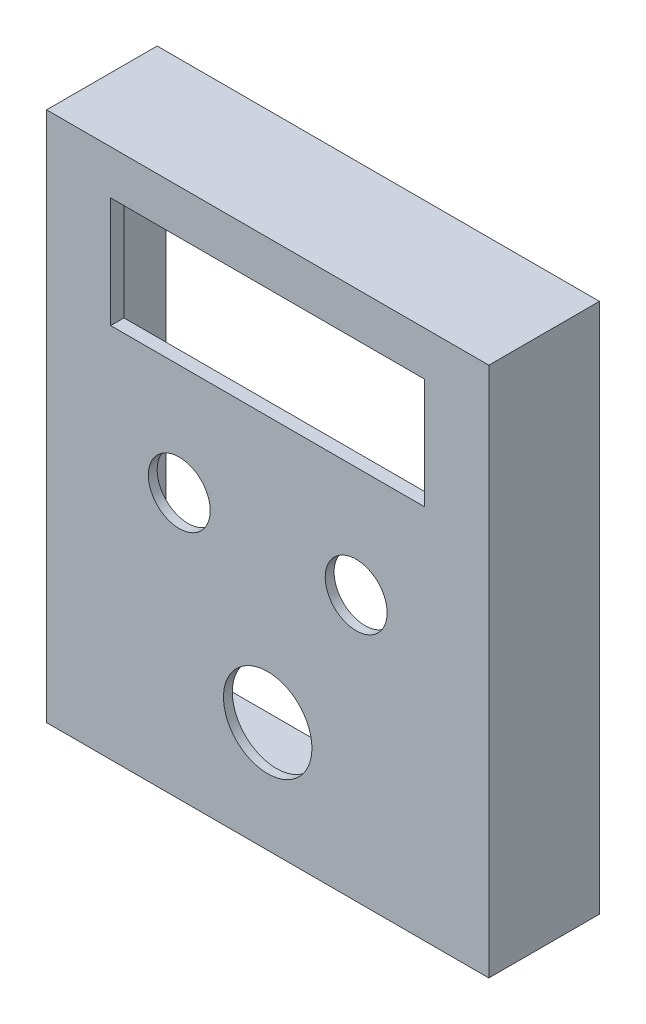
ISO-10303-21;
HEADER;
FILE_DESCRIPTION(('STEP AP214'),'2;1');
FILE_NAME('part.step','',(''),(''),'','','');
FILE_SCHEMA(('AUTOMOTIVE_DESIGN { 1 0 10303 214 1 1 1 1 }'));
ENDSEC;
DATA;
#1=APPLICATION_CONTEXT('core data for automotive mechanical design processes');
#2=APPLICATION_PROTOCOL_DEFINITION('international standard','automotive_design',2000,#1);
#3=PRODUCT_CONTEXT('',#1,'mechanical');
#4=PRODUCT('Part','Part','',(#3));
#5=PRODUCT_RELATED_PRODUCT_CATEGORY('part','',(#4));
#6=PRODUCT_DEFINITION_FORMATION('','',#4);
#7=PRODUCT_DEFINITION_CONTEXT('part definition',#1,'design');
#8=PRODUCT_DEFINITION('design','',#6,#7);
#9=PRODUCT_DEFINITION_SHAPE('','',#8);
#10=(LENGTH_UNIT() NAMED_UNIT(*) SI_UNIT(.MILLI.,.METRE.));
#11=(NAMED_UNIT(*) PLANE_ANGLE_UNIT() SI_UNIT($,.RADIAN.));
#12=(NAMED_UNIT(*) SI_UNIT($,.STERADIAN.) SOLID_ANGLE_UNIT());
#13=UNCERTAINTY_MEASURE_WITH_UNIT(LENGTH_MEASURE(1.E-05),#10,'distance_accuracy_value','');
#14=(GEOMETRIC_REPRESENTATION_CONTEXT(3) GLOBAL_UNCERTAINTY_ASSIGNED_CONTEXT((#13)) GLOBAL_UNIT_ASSIGNED_CONTEXT((#10,
#11,#12)) REPRESENTATION_CONTEXT('',''));
#15=CARTESIAN_POINT('',(0.,0.,0.));
#16=DIRECTION('',(0.,0.,1.));
#17=DIRECTION('',(1.,0.,0.));
#18=AXIS2_PLACEMENT_3D('',#15,#16,#17);
#19=CARTESIAN_POINT('',(0.,0.,0.));
#20=DIRECTION('',(0.,0.,1.));
#21=DIRECTION('',(1.,0.,0.));
#22=AXIS2_PLACEMENT_3D('',#19,#20,#21);
#23=PLANE('',#22);
#24=DIRECTION('',(0.,1.,0.));
#25=VECTOR('',#24,1.);
#26=CARTESIAN_POINT('',(98.,0.,0.));
#27=LINE('',#26,#25);
#28=CARTESIAN_POINT('',(98.,-58.,0.));
#29=VERTEX_POINT('',#28);
#30=CARTESIAN_POINT('',(98.,58.,0.));
#31=VERTEX_POINT('',#30);
#32=EDGE_CURVE('E11',#29,#31,#27,.T.);
#33=ORIENTED_EDGE('',*,*,#32,.T.);
#34=DIRECTION('',(-1.,0.,0.));
#35=VECTOR('',#34,1.);
#36=CARTESIAN_POINT('',(100.,58.,0.));
#37=LINE('',#36,#35);
#38=CARTESIAN_POINT('',(2.,58.,0.));
#39=VERTEX_POINT('',#38);
#40=EDGE_CURVE('E58',#31,#39,#37,.T.);
#41=ORIENTED_EDGE('',*,*,#40,.T.);
#42=DIRECTION('',(0.,1.,0.));
#43=VECTOR('',#42,1.);
#44=CARTESIAN_POINT('',(2.,0.,0.));
#45=LINE('',#44,#43);
#46=CARTESIAN_POINT('',(2.,-58.,0.));
#47=VERTEX_POINT('',#46);
#48=EDGE_CURVE('E154',#47,#39,#45,.T.);
#49=ORIENTED_EDGE('',*,*,#48,.F.);
#50=DIRECTION('',(1.,0.,0.));
#51=VECTOR('',#50,1.);
#52=CARTESIAN_POINT('',(100.,-58.,0.));
#53=LINE('',#52,#51);
#54=EDGE_CURVE('E44',#47,#29,#53,.T.);
#55=ORIENTED_EDGE('',*,*,#54,.T.);
#56=EDGE_LOOP('',(#33,#41,#49,#55));
#57=FACE_BOUND('',#56,.T.);
#58=DIRECTION('',(1.,0.,0.));
#59=VECTOR('',#58,1.);
#60=CARTESIAN_POINT('',(100.,-60.,0.));
#61=LINE('',#60,#59);
#62=CARTESIAN_POINT('',(0.,-60.,0.));
#63=VERTEX_POINT('',#62);
#64=CARTESIAN_POINT('',(100.,-60.,0.));
#65=VERTEX_POINT('',#64);
#66=EDGE_CURVE('E270',#63,#65,#61,.T.);
#67=ORIENTED_EDGE('',*,*,#66,.F.);
#68=DIRECTION('',(0.,1.,0.));
#69=VECTOR('',#68,1.);
#70=CARTESIAN_POINT('',(0.,0.,0.));
#71=LINE('',#70,#69);
#72=CARTESIAN_POINT('',(0.,60.,0.));
#73=VERTEX_POINT('',#72);
#74=EDGE_CURVE('E265',#63,#73,#71,.T.);
#75=ORIENTED_EDGE('',*,*,#74,.T.);
#76=DIRECTION('',(-1.,0.,0.));
#77=VECTOR('',#76,1.);
#78=CARTESIAN_POINT('',(100.,60.,0.));
#79=LINE('',#78,#77);
#80=CARTESIAN_POINT('',(100.,60.,0.));
#81=VERTEX_POINT('',#80);
#82=EDGE_CURVE('E269',#81,#73,#79,.T.);
#83=ORIENTED_EDGE('',*,*,#82,.F.);
#84=DIRECTION('',(0.,1.,0.));
#85=VECTOR('',#84,1.);
#86=CARTESIAN_POINT('',(100.,0.,0.));
#87=LINE('',#86,#85);
#88=EDGE_CURVE('E39',#65,#81,#87,.T.);
#89=ORIENTED_EDGE('',*,*,#88,.F.);
#90=EDGE_LOOP('',(#67,#75,#83,#89));
#91=FACE_BOUND('',#90,.T.);
#92=ADVANCED_FACE('F36',(#57,#91),#23,.F.);
#93=CARTESIAN_POINT('',(0.,0.,22.));
#94=DIRECTION('',(0.,0.,-1.));
#95=DIRECTION('',(-1.,0.,0.));
#96=AXIS2_PLACEMENT_3D('',#93,#94,#95);
#97=PLANE('',#96);
#98=DIRECTION('',(0.,1.,0.));
#99=VECTOR('',#98,1.);
#100=CARTESIAN_POINT('',(87.5,25.,22.));
#101=LINE('',#100,#99);
#102=CARTESIAN_POINT('',(87.5,23.,22.));
#103=VERTEX_POINT('',#102);
#104=CARTESIAN_POINT('',(87.5,52.,22.));
#105=VERTEX_POINT('',#104);
#106=EDGE_CURVE('E192',#103,#105,#101,.T.);
#107=ORIENTED_EDGE('',*,*,#106,.F.);
#108=DIRECTION('',(1.,0.,0.));
#109=VECTOR('',#108,1.);
#110=CARTESIAN_POINT('',(14.5,23.,22.));
#111=LINE('',#110,#109);
#112=CARTESIAN_POINT('',(12.5,23.,22.));
#113=VERTEX_POINT('',#112);
#114=EDGE_CURVE('E187',#113,#103,#111,.T.);
#115=ORIENTED_EDGE('',*,*,#114,.F.);
#116=DIRECTION('',(0.,-1.,0.));
#117=VECTOR('',#116,1.);
#118=CARTESIAN_POINT('',(12.5,25.,22.));
#119=LINE('',#118,#117);
#120=CARTESIAN_POINT('',(12.5,52.,22.));
#121=VERTEX_POINT('',#120);
#122=EDGE_CURVE('E199',#121,#113,#119,.T.);
#123=ORIENTED_EDGE('',*,*,#122,.F.);
#124=DIRECTION('',(-1.,0.,0.));
#125=VECTOR('',#124,1.);
#126=CARTESIAN_POINT('',(14.5,52.,22.));
#127=LINE('',#126,#125);
#128=EDGE_CURVE('E195',#105,#121,#127,.T.);
#129=ORIENTED_EDGE('',*,*,#128,.F.);
#130=EDGE_LOOP('',(#107,#115,#123,#129));
#131=FACE_BOUND('',#130,.T.);
#132=DIRECTION('',(0.,1.,0.));
#133=VECTOR('',#132,1.);
#134=CARTESIAN_POINT('',(85.5,25.,22.));
#135=LINE('',#134,#133);
#136=CARTESIAN_POINT('',(85.5,25.,22.));
#137=VERTEX_POINT('',#136);
#138=CARTESIAN_POINT('',(85.5,50.,22.));
#139=VERTEX_POINT('',#138);
#140=EDGE_CURVE('E204',#137,#139,#135,.T.);
#141=ORIENTED_EDGE('',*,*,#140,.T.);
#142=DIRECTION('',(-1.,0.,0.));
#143=VECTOR('',#142,1.);
#144=CARTESIAN_POINT('',(14.5,50.,22.));
#145=LINE('',#144,#143);
#146=CARTESIAN_POINT('',(14.5,50.,22.));
#147=VERTEX_POINT('',#146);
#148=EDGE_CURVE('E206',#139,#147,#145,.T.);
#149=ORIENTED_EDGE('',*,*,#148,.T.);
#150=DIRECTION('',(0.,-1.,0.));
#151=VECTOR('',#150,1.);
#152=CARTESIAN_POINT('',(14.5,25.,22.));
#153=LINE('',#152,#151);
#154=CARTESIAN_POINT('',(14.5,25.,22.));
#155=VERTEX_POINT('',#154);
#156=EDGE_CURVE('E209',#147,#155,#153,.T.);
#157=ORIENTED_EDGE('',*,*,#156,.T.);
#158=DIRECTION('',(1.,0.,0.));
#159=VECTOR('',#158,1.);
#160=CARTESIAN_POINT('',(14.5,25.,22.));
#161=LINE('',#160,#159);
#162=EDGE_CURVE('E211',#155,#137,#161,.T.);
#163=ORIENTED_EDGE('',*,*,#162,.T.);
#164=EDGE_LOOP('',(#141,#149,#157,#163));
#165=FACE_BOUND('',#164,.T.);
#166=ADVANCED_FACE('F301',(#131,#165),#97,.T.);
#167=CARTESIAN_POINT('',(14.5,25.,22.));
#168=DIRECTION('',(-1.,0.,0.));
#169=DIRECTION('',(0.,0.,1.));
#170=AXIS2_PLACEMENT_3D('',#167,#168,#169);
#171=PLANE('',#170);
#172=DIRECTION('',(0.,-1.,0.));
#173=VECTOR('',#172,1.);
#174=CARTESIAN_POINT('',(14.5,25.,25.));
#175=LINE('',#174,#173);
#176=CARTESIAN_POINT('',(14.5,50.,25.));
#177=VERTEX_POINT('',#176);
#178=CARTESIAN_POINT('',(14.5,25.,25.));
#179=VERTEX_POINT('',#178);
#180=EDGE_CURVE('E218',#177,#179,#175,.T.);
#181=ORIENTED_EDGE('',*,*,#180,.T.);
#182=DIRECTION('',(0.,0.,1.));
#183=VECTOR('',#182,1.);
#184=CARTESIAN_POINT('',(14.5,25.,22.));
#185=LINE('',#184,#183);
#186=EDGE_CURVE('E226',#155,#179,#185,.T.);
#187=ORIENTED_EDGE('',*,*,#186,.F.);
#188=ORIENTED_EDGE('',*,*,#156,.F.);
#189=DIRECTION('',(0.,0.,1.));
#190=VECTOR('',#189,1.);
#191=CARTESIAN_POINT('',(14.5,50.,22.));
#192=LINE('',#191,#190);
#193=EDGE_CURVE('E228',#147,#177,#192,.T.);
#194=ORIENTED_EDGE('',*,*,#193,.T.);
#195=EDGE_LOOP('',(#181,#187,#188,#194));
#196=FACE_BOUND('',#195,.T.);
#197=ADVANCED_FACE('F305',(#196),#171,.F.);
#198=CARTESIAN_POINT('',(14.5,25.,22.));
#199=DIRECTION('',(0.,-1.,0.));
#200=DIRECTION('',(0.,0.,-1.));
#201=AXIS2_PLACEMENT_3D('',#198,#199,#200);
#202=PLANE('',#201);
#203=DIRECTION('',(1.,0.,0.));
#204=VECTOR('',#203,1.);
#205=CARTESIAN_POINT('',(14.5,25.,25.));
#206=LINE('',#205,#204);
#207=CARTESIAN_POINT('',(85.5,25.,25.));
#208=VERTEX_POINT('',#207);
#209=EDGE_CURVE('E207',#179,#208,#206,.T.);
#210=ORIENTED_EDGE('',*,*,#209,.T.);
#211=DIRECTION('',(0.,0.,1.));
#212=VECTOR('',#211,1.);
#213=CARTESIAN_POINT('',(85.5,25.,22.));
#214=LINE('',#213,#212);
#215=EDGE_CURVE('E223',#137,#208,#214,.T.);
#216=ORIENTED_EDGE('',*,*,#215,.F.);
#217=ORIENTED_EDGE('',*,*,#162,.F.);
#218=ORIENTED_EDGE('',*,*,#186,.T.);
#219=EDGE_LOOP('',(#210,#216,#217,#218));
#220=FACE_BOUND('',#219,.T.);
#221=ADVANCED_FACE('F347',(#220),#202,.F.);
#222=CARTESIAN_POINT('',(85.5,25.,22.));
#223=DIRECTION('',(1.,0.,0.));
#224=DIRECTION('',(0.,0.,-1.));
#225=AXIS2_PLACEMENT_3D('',#222,#223,#224);
#226=PLANE('',#225);
#227=DIRECTION('',(0.,1.,0.));
#228=VECTOR('',#227,1.);
#229=CARTESIAN_POINT('',(85.5,25.,25.));
#230=LINE('',#229,#228);
#231=CARTESIAN_POINT('',(85.5,50.,25.));
#232=VERTEX_POINT('',#231);
#233=EDGE_CURVE('E164',#208,#232,#230,.T.);
#234=ORIENTED_EDGE('',*,*,#233,.T.);
#235=DIRECTION('',(0.,0.,1.));
#236=VECTOR('',#235,1.);
#237=CARTESIAN_POINT('',(85.5,50.,22.));
#238=LINE('',#237,#236);
#239=EDGE_CURVE('E213',#139,#232,#238,.T.);
#240=ORIENTED_EDGE('',*,*,#239,.F.);
#241=ORIENTED_EDGE('',*,*,#140,.F.);
#242=ORIENTED_EDGE('',*,*,#215,.T.);
#243=EDGE_LOOP('',(#234,#240,#241,#242));
#244=FACE_BOUND('',#243,.T.);
#245=ADVANCED_FACE('F350',(#244),#226,.F.);
#246=CARTESIAN_POINT('',(14.5,50.,22.));
#247=DIRECTION('',(0.,1.,0.));
#248=DIRECTION('',(0.,0.,1.));
#249=AXIS2_PLACEMENT_3D('',#246,#247,#248);
#250=PLANE('',#249);
#251=DIRECTION('',(-1.,0.,0.));
#252=VECTOR('',#251,1.);
#253=CARTESIAN_POINT('',(14.5,50.,25.));
#254=LINE('',#253,#252);
#255=EDGE_CURVE('E215',#232,#177,#254,.T.);
#256=ORIENTED_EDGE('',*,*,#255,.T.);
#257=ORIENTED_EDGE('',*,*,#193,.F.);
#258=ORIENTED_EDGE('',*,*,#148,.F.);
#259=ORIENTED_EDGE('',*,*,#239,.T.);
#260=EDGE_LOOP('',(#256,#257,#258,#259));
#261=FACE_BOUND('',#260,.T.);
#262=ADVANCED_FACE('F355',(#261),#250,.F.);
#263=CARTESIAN_POINT('',(87.5,25.,22.));
#264=DIRECTION('',(1.,0.,0.));
#265=DIRECTION('',(0.,0.,-1.));
#266=AXIS2_PLACEMENT_3D('',#263,#264,#265);
#267=PLANE('',#266);
#268=DIRECTION('',(0.,1.,0.));
#269=VECTOR('',#268,1.);
#270=CARTESIAN_POINT('',(87.5,25.,23.));
#271=LINE('',#270,#269);
#272=CARTESIAN_POINT('',(87.5,23.,23.));
#273=VERTEX_POINT('',#272);
#274=CARTESIAN_POINT('',(87.5,52.,23.));
#275=VERTEX_POINT('',#274);
#276=EDGE_CURVE('E254',#273,#275,#271,.T.);
#277=ORIENTED_EDGE('',*,*,#276,.F.);
#278=DIRECTION('',(0.,0.,1.));
#279=VECTOR('',#278,1.);
#280=CARTESIAN_POINT('',(87.5,23.,22.));
#281=LINE('',#280,#279);
#282=EDGE_CURVE('E155',#103,#273,#281,.T.);
#283=ORIENTED_EDGE('',*,*,#282,.F.);
#284=ORIENTED_EDGE('',*,*,#106,.T.);
#285=DIRECTION('',(0.,0.,1.));
#286=VECTOR('',#285,1.);
#287=CARTESIAN_POINT('',(87.5,52.,22.));
#288=LINE('',#287,#286);
#289=EDGE_CURVE('E183',#105,#275,#288,.T.);
#290=ORIENTED_EDGE('',*,*,#289,.T.);
#291=EDGE_LOOP('',(#277,#283,#284,#290));
#292=FACE_BOUND('',#291,.T.);
#293=ADVANCED_FACE('F329',(#292),#267,.T.);
#294=CARTESIAN_POINT('',(14.5,23.,22.));
#295=DIRECTION('',(0.,-1.,0.));
#296=DIRECTION('',(0.,0.,-1.));
#297=AXIS2_PLACEMENT_3D('',#294,#295,#296);
#298=PLANE('',#297);
#299=DIRECTION('',(1.,0.,0.));
#300=VECTOR('',#299,1.);
#301=CARTESIAN_POINT('',(14.5,23.,23.));
#302=LINE('',#301,#300);
#303=CARTESIAN_POINT('',(12.5,23.,23.));
#304=VERTEX_POINT('',#303);
#305=EDGE_CURVE('E196',#304,#273,#302,.T.);
#306=ORIENTED_EDGE('',*,*,#305,.F.);
#307=DIRECTION('',(0.,0.,1.));
#308=VECTOR('',#307,1.);
#309=CARTESIAN_POINT('',(12.5,23.,22.));
#310=LINE('',#309,#308);
#311=EDGE_CURVE('E189',#113,#304,#310,.T.);
#312=ORIENTED_EDGE('',*,*,#311,.F.);
#313=ORIENTED_EDGE('',*,*,#114,.T.);
#314=ORIENTED_EDGE('',*,*,#282,.T.);
#315=EDGE_LOOP('',(#306,#312,#313,#314));
#316=FACE_BOUND('',#315,.T.);
#317=ADVANCED_FACE('F325',(#316),#298,.T.);
#318=CARTESIAN_POINT('',(12.5,25.,22.));
#319=DIRECTION('',(-1.,0.,0.));
#320=DIRECTION('',(0.,0.,1.));
#321=AXIS2_PLACEMENT_3D('',#318,#319,#320);
#322=PLANE('',#321);
#323=DIRECTION('',(0.,-1.,0.));
#324=VECTOR('',#323,1.);
#325=CARTESIAN_POINT('',(12.5,25.,23.));
#326=LINE('',#325,#324);
#327=CARTESIAN_POINT('',(12.5,52.,23.));
#328=VERTEX_POINT('',#327);
#329=EDGE_CURVE('E175',#328,#304,#326,.T.);
#330=ORIENTED_EDGE('',*,*,#329,.F.);
#331=DIRECTION('',(0.,0.,1.));
#332=VECTOR('',#331,1.);
#333=CARTESIAN_POINT('',(12.5,52.,22.));
#334=LINE('',#333,#332);
#335=EDGE_CURVE('E186',#121,#328,#334,.T.);
#336=ORIENTED_EDGE('',*,*,#335,.F.);
#337=ORIENTED_EDGE('',*,*,#122,.T.);
#338=ORIENTED_EDGE('',*,*,#311,.T.);
#339=EDGE_LOOP('',(#330,#336,#337,#338));
#340=FACE_BOUND('',#339,.T.);
#341=ADVANCED_FACE('F335',(#340),#322,.T.);
#342=CARTESIAN_POINT('',(14.5,52.,22.));
#343=DIRECTION('',(0.,1.,0.));
#344=DIRECTION('',(0.,0.,1.));
#345=AXIS2_PLACEMENT_3D('',#342,#343,#344);
#346=PLANE('',#345);
#347=DIRECTION('',(-1.,0.,0.));
#348=VECTOR('',#347,1.);
#349=CARTESIAN_POINT('',(14.5,52.,23.));
#350=LINE('',#349,#348);
#351=EDGE_CURVE('E313',#275,#328,#350,.T.);
#352=ORIENTED_EDGE('',*,*,#351,.F.);
#353=ORIENTED_EDGE('',*,*,#289,.F.);
#354=ORIENTED_EDGE('',*,*,#128,.T.);
#355=ORIENTED_EDGE('',*,*,#335,.T.);
#356=EDGE_LOOP('',(#352,#353,#354,#355));
#357=FACE_BOUND('',#356,.T.);
#358=ADVANCED_FACE('F334',(#357),#346,.T.);
#359=CARTESIAN_POINT('',(50.,-35.,22.));
#360=DIRECTION('',(0.,0.,1.));
#361=DIRECTION('',(1.,0.,0.));
#362=AXIS2_PLACEMENT_3D('',#359,#360,#361);
#363=CYLINDRICAL_SURFACE('',#362,10.);
#364=CARTESIAN_POINT('',(50.,-35.,23.));
#365=DIRECTION('',(0.,0.,-1.));
#366=DIRECTION('',(-1.,0.,0.));
#367=AXIS2_PLACEMENT_3D('',#364,#365,#366);
#368=CIRCLE('',#367,10.);
#369=CARTESIAN_POINT('',(40.,-35.,23.));
#370=VERTEX_POINT('',#369);
#371=EDGE_CURVE('E251',#370,#370,#368,.T.);
#372=ORIENTED_EDGE('',*,*,#371,.T.);
#373=EDGE_LOOP('',(#372));
#374=FACE_BOUND('',#373,.T.);
#375=CARTESIAN_POINT('',(50.,-35.,25.));
#376=DIRECTION('',(0.,0.,1.));
#377=DIRECTION('',(1.,0.,0.));
#378=AXIS2_PLACEMENT_3D('',#375,#376,#377);
#379=CIRCLE('',#378,10.);
#380=CARTESIAN_POINT('',(60.,-35.,25.));
#381=VERTEX_POINT('',#380);
#382=EDGE_CURVE('E255',#381,#381,#379,.T.);
#383=ORIENTED_EDGE('',*,*,#382,.T.);
#384=EDGE_LOOP('',(#383));
#385=FACE_BOUND('',#384,.T.);
#386=ADVANCED_FACE('F342',(#374,#385),#363,.F.);
#387=CARTESIAN_POINT('',(70.,0.,22.));
#388=DIRECTION('',(0.,0.,1.));
#389=DIRECTION('',(1.,0.,0.));
#390=AXIS2_PLACEMENT_3D('',#387,#388,#389);
#391=CYLINDRICAL_SURFACE('',#390,7.);
#392=CARTESIAN_POINT('',(70.,0.,23.));
#393=DIRECTION('',(0.,0.,-1.));
#394=DIRECTION('',(-1.,0.,0.));
#395=AXIS2_PLACEMENT_3D('',#392,#393,#394);
#396=CIRCLE('',#395,7.);
#397=CARTESIAN_POINT('',(63.,0.,23.));
#398=VERTEX_POINT('',#397);
#399=EDGE_CURVE('E256',#398,#398,#396,.T.);
#400=ORIENTED_EDGE('',*,*,#399,.T.);
#401=EDGE_LOOP('',(#400));
#402=FACE_BOUND('',#401,.T.);
#403=CARTESIAN_POINT('',(70.,0.,25.));
#404=DIRECTION('',(0.,0.,1.));
#405=DIRECTION('',(-1.,0.,0.));
#406=AXIS2_PLACEMENT_3D('',#403,#404,#405);
#407=CIRCLE('',#406,7.);
#408=CARTESIAN_POINT('',(63.,0.,25.));
#409=VERTEX_POINT('',#408);
#410=EDGE_CURVE('E389',#409,#409,#407,.T.);
#411=ORIENTED_EDGE('',*,*,#410,.T.);
#412=EDGE_LOOP('',(#411));
#413=FACE_BOUND('',#412,.T.);
#414=ADVANCED_FACE('F399',(#402,#413),#391,.F.);
#415=CARTESIAN_POINT('',(30.,0.,22.));
#416=DIRECTION('',(0.,0.,1.));
#417=DIRECTION('',(1.,0.,0.));
#418=AXIS2_PLACEMENT_3D('',#415,#416,#417);
#419=CYLINDRICAL_SURFACE('',#418,7.);
#420=CARTESIAN_POINT('',(30.,0.,23.));
#421=DIRECTION('',(0.,0.,-1.));
#422=DIRECTION('',(-1.,0.,0.));
#423=AXIS2_PLACEMENT_3D('',#420,#421,#422);
#424=CIRCLE('',#423,7.);
#425=CARTESIAN_POINT('',(23.,0.,23.));
#426=VERTEX_POINT('',#425);
#427=EDGE_CURVE('E259',#426,#426,#424,.T.);
#428=ORIENTED_EDGE('',*,*,#427,.T.);
#429=EDGE_LOOP('',(#428));
#430=FACE_BOUND('',#429,.T.);
#431=CARTESIAN_POINT('',(30.,0.,25.));
#432=DIRECTION('',(0.,0.,1.));
#433=DIRECTION('',(1.,0.,0.));
#434=AXIS2_PLACEMENT_3D('',#431,#432,#433);
#435=CIRCLE('',#434,7.);
#436=CARTESIAN_POINT('',(37.,0.,25.));
#437=VERTEX_POINT('',#436);
#438=EDGE_CURVE('E260',#437,#437,#435,.T.);
#439=ORIENTED_EDGE('',*,*,#438,.T.);
#440=EDGE_LOOP('',(#439));
#441=FACE_BOUND('',#440,.T.);
#442=ADVANCED_FACE('F397',(#430,#441),#419,.F.);
#443=CARTESIAN_POINT('',(100.,-60.,23.));
#444=DIRECTION('',(0.,0.,-1.));
#445=DIRECTION('',(-1.,0.,0.));
#446=AXIS2_PLACEMENT_3D('',#443,#444,#445);
#447=PLANE('',#446);
#448=ORIENTED_EDGE('',*,*,#427,.F.);
#449=EDGE_LOOP('',(#448));
#450=FACE_BOUND('',#449,.T.);
#451=ORIENTED_EDGE('',*,*,#399,.F.);
#452=EDGE_LOOP('',(#451));
#453=FACE_BOUND('',#452,.T.);
#454=ORIENTED_EDGE('',*,*,#371,.F.);
#455=EDGE_LOOP('',(#454));
#456=FACE_BOUND('',#455,.T.);
#457=ORIENTED_EDGE('',*,*,#351,.T.);
#458=ORIENTED_EDGE('',*,*,#329,.T.);
#459=ORIENTED_EDGE('',*,*,#305,.T.);
#460=ORIENTED_EDGE('',*,*,#276,.T.);
#461=EDGE_LOOP('',(#457,#458,#459,#460));
#462=FACE_BOUND('',#461,.T.);
#463=DIRECTION('',(0.,-1.,0.));
#464=VECTOR('',#463,1.);
#465=CARTESIAN_POINT('',(2.,0.,23.));
#466=LINE('',#465,#464);
#467=CARTESIAN_POINT('',(2.,58.,23.));
#468=VERTEX_POINT('',#467);
#469=CARTESIAN_POINT('',(2.,-58.,23.));
#470=VERTEX_POINT('',#469);
#471=EDGE_CURVE('E152',#468,#470,#466,.T.);
#472=ORIENTED_EDGE('',*,*,#471,.F.);
#473=DIRECTION('',(-1.,0.,0.));
#474=VECTOR('',#473,1.);
#475=CARTESIAN_POINT('',(100.,58.,23.));
#476=LINE('',#475,#474);
#477=CARTESIAN_POINT('',(98.,58.,23.));
#478=VERTEX_POINT('',#477);
#479=EDGE_CURVE('E158',#478,#468,#476,.T.);
#480=ORIENTED_EDGE('',*,*,#479,.F.);
#481=DIRECTION('',(0.,-1.,0.));
#482=VECTOR('',#481,1.);
#483=CARTESIAN_POINT('',(98.,0.,23.));
#484=LINE('',#483,#482);
#485=CARTESIAN_POINT('',(98.,-58.,23.));
#486=VERTEX_POINT('',#485);
#487=EDGE_CURVE('E179',#478,#486,#484,.T.);
#488=ORIENTED_EDGE('',*,*,#487,.T.);
#489=DIRECTION('',(-1.,0.,0.));
#490=VECTOR('',#489,1.);
#491=CARTESIAN_POINT('',(100.,-58.,23.));
#492=LINE('',#491,#490);
#493=EDGE_CURVE('E165',#486,#470,#492,.T.);
#494=ORIENTED_EDGE('',*,*,#493,.T.);
#495=EDGE_LOOP('',(#472,#480,#488,#494));
#496=FACE_BOUND('',#495,.T.);
#497=ADVANCED_FACE('F167',(#450,#453,#456,#462,#496),#447,.T.);
#498=CARTESIAN_POINT('',(100.,58.,25.));
#499=DIRECTION('',(0.,-1.,0.));
#500=DIRECTION('',(0.,0.,-1.));
#501=AXIS2_PLACEMENT_3D('',#498,#499,#500);
#502=PLANE('',#501);
#503=ORIENTED_EDGE('',*,*,#40,.F.);
#504=DIRECTION('',(0.,0.,1.));
#505=VECTOR('',#504,1.);
#506=CARTESIAN_POINT('',(98.,58.,0.));
#507=LINE('',#506,#505);
#508=EDGE_CURVE('E161',#31,#478,#507,.T.);
#509=ORIENTED_EDGE('',*,*,#508,.T.);
#510=ORIENTED_EDGE('',*,*,#479,.T.);
#511=DIRECTION('',(0.,0.,1.));
#512=VECTOR('',#511,1.);
#513=CARTESIAN_POINT('',(2.,58.,0.));
#514=LINE('',#513,#512);
#515=EDGE_CURVE('E147',#39,#468,#514,.T.);
#516=ORIENTED_EDGE('',*,*,#515,.F.);
#517=EDGE_LOOP('',(#503,#509,#510,#516));
#518=FACE_BOUND('',#517,.T.);
#519=ADVANCED_FACE('F159',(#518),#502,.T.);
#520=CARTESIAN_POINT('',(100.,-58.,25.));
#521=DIRECTION('',(0.,1.,0.));
#522=DIRECTION('',(0.,0.,1.));
#523=AXIS2_PLACEMENT_3D('',#520,#521,#522);
#524=PLANE('',#523);
#525=ORIENTED_EDGE('',*,*,#54,.F.);
#526=DIRECTION('',(0.,0.,-1.));
#527=VECTOR('',#526,1.);
#528=CARTESIAN_POINT('',(2.,-58.,0.));
#529=LINE('',#528,#527);
#530=EDGE_CURVE('E170',#470,#47,#529,.T.);
#531=ORIENTED_EDGE('',*,*,#530,.F.);
#532=ORIENTED_EDGE('',*,*,#493,.F.);
#533=DIRECTION('',(0.,0.,-1.));
#534=VECTOR('',#533,1.);
#535=CARTESIAN_POINT('',(98.,-58.,0.));
#536=LINE('',#535,#534);
#537=EDGE_CURVE('E178',#486,#29,#536,.T.);
#538=ORIENTED_EDGE('',*,*,#537,.T.);
#539=EDGE_LOOP('',(#525,#531,#532,#538));
#540=FACE_BOUND('',#539,.T.);
#541=ADVANCED_FACE('F415',(#540),#524,.T.);
#542=CARTESIAN_POINT('',(2.,0.,0.));
#543=DIRECTION('',(-1.,0.,0.));
#544=DIRECTION('',(0.,0.,1.));
#545=AXIS2_PLACEMENT_3D('',#542,#543,#544);
#546=PLANE('',#545);
#547=ORIENTED_EDGE('',*,*,#530,.T.);
#548=ORIENTED_EDGE('',*,*,#48,.T.);
#549=ORIENTED_EDGE('',*,*,#515,.T.);
#550=ORIENTED_EDGE('',*,*,#471,.T.);
#551=EDGE_LOOP('',(#547,#548,#549,#550));
#552=FACE_BOUND('',#551,.T.);
#553=ADVANCED_FACE('F150',(#552),#546,.F.);
#554=CARTESIAN_POINT('',(98.,0.,0.));
#555=DIRECTION('',(-1.,0.,0.));
#556=DIRECTION('',(0.,0.,1.));
#557=AXIS2_PLACEMENT_3D('',#554,#555,#556);
#558=PLANE('',#557);
#559=ORIENTED_EDGE('',*,*,#32,.F.);
#560=ORIENTED_EDGE('',*,*,#537,.F.);
#561=ORIENTED_EDGE('',*,*,#487,.F.);
#562=ORIENTED_EDGE('',*,*,#508,.F.);
#563=EDGE_LOOP('',(#559,#560,#561,#562));
#564=FACE_BOUND('',#563,.T.);
#565=ADVANCED_FACE('F310',(#564),#558,.T.);
#566=CARTESIAN_POINT('',(100.,60.,25.));
#567=DIRECTION('',(0.,-1.,0.));
#568=DIRECTION('',(0.,0.,-1.));
#569=AXIS2_PLACEMENT_3D('',#566,#567,#568);
#570=PLANE('',#569);
#571=DIRECTION('',(0.,0.,1.));
#572=VECTOR('',#571,1.);
#573=CARTESIAN_POINT('',(100.,60.,25.));
#574=LINE('',#573,#572);
#575=CARTESIAN_POINT('',(100.,60.,25.));
#576=VERTEX_POINT('',#575);
#577=EDGE_CURVE('E232',#81,#576,#574,.T.);
#578=ORIENTED_EDGE('',*,*,#577,.F.);
#579=ORIENTED_EDGE('',*,*,#82,.T.);
#580=DIRECTION('',(0.,0.,1.));
#581=VECTOR('',#580,1.);
#582=CARTESIAN_POINT('',(0.,60.,25.));
#583=LINE('',#582,#581);
#584=CARTESIAN_POINT('',(0.,60.,25.));
#585=VERTEX_POINT('',#584);
#586=EDGE_CURVE('E225',#73,#585,#583,.T.);
#587=ORIENTED_EDGE('',*,*,#586,.T.);
#588=DIRECTION('',(-1.,0.,0.));
#589=VECTOR('',#588,1.);
#590=CARTESIAN_POINT('',(100.,60.,25.));
#591=LINE('',#590,#589);
#592=EDGE_CURVE('E248',#576,#585,#591,.T.);
#593=ORIENTED_EDGE('',*,*,#592,.F.);
#594=EDGE_LOOP('',(#578,#579,#587,#593));
#595=FACE_BOUND('',#594,.T.);
#596=ADVANCED_FACE('F275',(#595),#570,.F.);
#597=CARTESIAN_POINT('',(100.,-60.,25.));
#598=DIRECTION('',(0.,0.,-1.));
#599=DIRECTION('',(-1.,0.,0.));
#600=AXIS2_PLACEMENT_3D('',#597,#598,#599);
#601=PLANE('',#600);
#602=ORIENTED_EDGE('',*,*,#438,.F.);
#603=EDGE_LOOP('',(#602));
#604=FACE_BOUND('',#603,.T.);
#605=ORIENTED_EDGE('',*,*,#410,.F.);
#606=EDGE_LOOP('',(#605));
#607=FACE_BOUND('',#606,.T.);
#608=ORIENTED_EDGE('',*,*,#382,.F.);
#609=EDGE_LOOP('',(#608));
#610=FACE_BOUND('',#609,.T.);
#611=ORIENTED_EDGE('',*,*,#255,.F.);
#612=ORIENTED_EDGE('',*,*,#233,.F.);
#613=ORIENTED_EDGE('',*,*,#209,.F.);
#614=ORIENTED_EDGE('',*,*,#180,.F.);
#615=EDGE_LOOP('',(#611,#612,#613,#614));
#616=FACE_BOUND('',#615,.T.);
#617=DIRECTION('',(0.,-1.,0.));
#618=VECTOR('',#617,1.);
#619=CARTESIAN_POINT('',(0.,-60.,25.));
#620=LINE('',#619,#618);
#621=CARTESIAN_POINT('',(0.,-60.,25.));
#622=VERTEX_POINT('',#621);
#623=EDGE_CURVE('E242',#585,#622,#620,.T.);
#624=ORIENTED_EDGE('',*,*,#623,.T.);
#625=DIRECTION('',(-1.,0.,0.));
#626=VECTOR('',#625,1.);
#627=CARTESIAN_POINT('',(100.,-60.,25.));
#628=LINE('',#627,#626);
#629=CARTESIAN_POINT('',(100.,-60.,25.));
#630=VERTEX_POINT('',#629);
#631=EDGE_CURVE('E240',#630,#622,#628,.T.);
#632=ORIENTED_EDGE('',*,*,#631,.F.);
#633=DIRECTION('',(0.,-1.,0.));
#634=VECTOR('',#633,1.);
#635=CARTESIAN_POINT('',(100.,-60.,25.));
#636=LINE('',#635,#634);
#637=EDGE_CURVE('E234',#576,#630,#636,.T.);
#638=ORIENTED_EDGE('',*,*,#637,.F.);
#639=ORIENTED_EDGE('',*,*,#592,.T.);
#640=EDGE_LOOP('',(#624,#632,#638,#639));
#641=FACE_BOUND('',#640,.T.);
#642=ADVANCED_FACE('F286',(#604,#607,#610,#616,#641),#601,.F.);
#643=CARTESIAN_POINT('',(100.,-60.,25.));
#644=DIRECTION('',(0.,1.,0.));
#645=DIRECTION('',(0.,0.,1.));
#646=AXIS2_PLACEMENT_3D('',#643,#644,#645);
#647=PLANE('',#646);
#648=DIRECTION('',(0.,0.,-1.));
#649=VECTOR('',#648,1.);
#650=CARTESIAN_POINT('',(0.,-60.,25.));
#651=LINE('',#650,#649);
#652=EDGE_CURVE('E235',#622,#63,#651,.T.);
#653=ORIENTED_EDGE('',*,*,#652,.T.);
#654=ORIENTED_EDGE('',*,*,#66,.T.);
#655=DIRECTION('',(0.,0.,-1.));
#656=VECTOR('',#655,1.);
#657=CARTESIAN_POINT('',(100.,-60.,25.));
#658=LINE('',#657,#656);
#659=EDGE_CURVE('E237',#630,#65,#658,.T.);
#660=ORIENTED_EDGE('',*,*,#659,.F.);
#661=ORIENTED_EDGE('',*,*,#631,.T.);
#662=EDGE_LOOP('',(#653,#654,#660,#661));
#663=FACE_BOUND('',#662,.T.);
#664=ADVANCED_FACE('F290',(#663),#647,.F.);
#665=CARTESIAN_POINT('',(0.,0.,0.));
#666=DIRECTION('',(-1.,0.,0.));
#667=DIRECTION('',(0.,0.,1.));
#668=AXIS2_PLACEMENT_3D('',#665,#666,#667);
#669=PLANE('',#668);
#670=ORIENTED_EDGE('',*,*,#74,.F.);
#671=ORIENTED_EDGE('',*,*,#652,.F.);
#672=ORIENTED_EDGE('',*,*,#623,.F.);
#673=ORIENTED_EDGE('',*,*,#586,.F.);
#674=EDGE_LOOP('',(#670,#671,#672,#673));
#675=FACE_BOUND('',#674,.T.);
#676=ADVANCED_FACE('F283',(#675),#669,.T.);
#677=CARTESIAN_POINT('',(100.,0.,0.));
#678=DIRECTION('',(-1.,0.,0.));
#679=DIRECTION('',(0.,0.,1.));
#680=AXIS2_PLACEMENT_3D('',#677,#678,#679);
#681=PLANE('',#680);
#682=ORIENTED_EDGE('',*,*,#659,.T.);
#683=ORIENTED_EDGE('',*,*,#88,.T.);
#684=ORIENTED_EDGE('',*,*,#577,.T.);
#685=ORIENTED_EDGE('',*,*,#637,.T.);
#686=EDGE_LOOP('',(#682,#683,#684,#685));
#687=FACE_BOUND('',#686,.T.);
#688=ADVANCED_FACE('F292',(#687),#681,.F.);
#689=CLOSED_SHELL('',(#92,#166,#197,#221,#245,#262,#293,#317,#341,#358,#386,#414,#442,#497,#519,
#541,#553,#565,#596,#642,#664,#676,#688));
#690=MANIFOLD_SOLID_BREP('B2',#689);
#691=ADVANCED_BREP_SHAPE_REPRESENTATION('',(#18,#690),#14);
#692=SHAPE_DEFINITION_REPRESENTATION(#9,#691);
ENDSEC;
END-ISO-10303-21;
